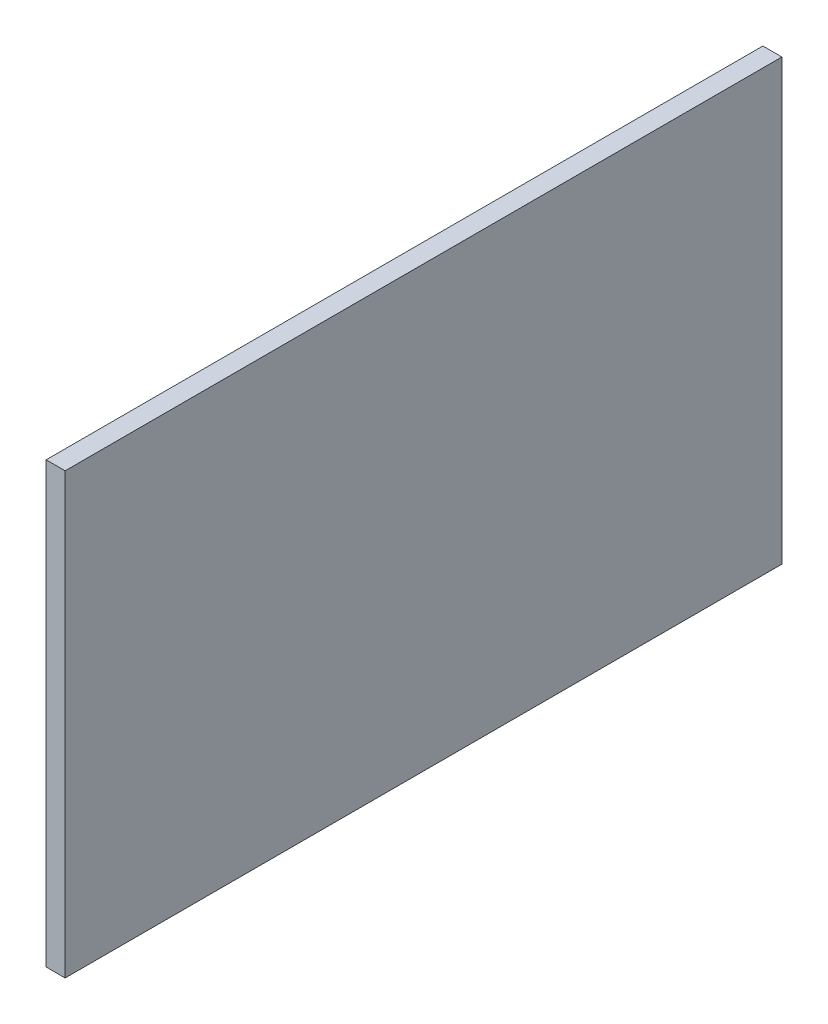
ISO-10303-21;
HEADER;
FILE_DESCRIPTION(('STEP AP214'),'2;1');
FILE_NAME('part.step','',(''),(''),'','','');
FILE_SCHEMA(('AUTOMOTIVE_DESIGN { 1 0 10303 214 1 1 1 1 }'));
ENDSEC;
DATA;
#1=APPLICATION_CONTEXT('core data for automotive mechanical design processes');
#2=APPLICATION_PROTOCOL_DEFINITION('international standard','automotive_design',2000,#1);
#3=PRODUCT_CONTEXT('',#1,'mechanical');
#4=PRODUCT('Part','Part','',(#3));
#5=PRODUCT_RELATED_PRODUCT_CATEGORY('part','',(#4));
#6=PRODUCT_DEFINITION_FORMATION('','',#4);
#7=PRODUCT_DEFINITION_CONTEXT('part definition',#1,'design');
#8=PRODUCT_DEFINITION('design','',#6,#7);
#9=PRODUCT_DEFINITION_SHAPE('','',#8);
#10=(LENGTH_UNIT() NAMED_UNIT(*) SI_UNIT(.MILLI.,.METRE.));
#11=(NAMED_UNIT(*) PLANE_ANGLE_UNIT() SI_UNIT($,.RADIAN.));
#12=(NAMED_UNIT(*) SI_UNIT($,.STERADIAN.) SOLID_ANGLE_UNIT());
#13=UNCERTAINTY_MEASURE_WITH_UNIT(LENGTH_MEASURE(1.E-05),#10,'distance_accuracy_value','');
#14=(GEOMETRIC_REPRESENTATION_CONTEXT(3) GLOBAL_UNCERTAINTY_ASSIGNED_CONTEXT((#13)) GLOBAL_UNIT_ASSIGNED_CONTEXT((#10,
#11,#12)) REPRESENTATION_CONTEXT('',''));
#15=CARTESIAN_POINT('',(0.,0.,0.));
#16=DIRECTION('',(0.,0.,1.));
#17=DIRECTION('',(1.,0.,0.));
#18=AXIS2_PLACEMENT_3D('',#15,#16,#17);
#19=CARTESIAN_POINT('',(12.,0.,0.));
#20=DIRECTION('',(0.,0.,-1.));
#21=DIRECTION('',(-1.,0.,0.));
#22=AXIS2_PLACEMENT_3D('',#19,#20,#21);
#23=PLANE('',#22);
#24=DIRECTION('',(0.,-1.,0.));
#25=VECTOR('',#24,1.);
#26=CARTESIAN_POINT('',(0.,0.,0.));
#27=LINE('',#26,#25);
#28=CARTESIAN_POINT('',(0.,277.,0.));
#29=VERTEX_POINT('',#28);
#30=CARTESIAN_POINT('',(0.,0.,0.));
#31=VERTEX_POINT('',#30);
#32=EDGE_CURVE('E95',#29,#31,#27,.T.);
#33=ORIENTED_EDGE('',*,*,#32,.T.);
#34=DIRECTION('',(-1.,0.,0.));
#35=VECTOR('',#34,1.);
#36=CARTESIAN_POINT('',(12.,0.,0.));
#37=LINE('',#36,#35);
#38=CARTESIAN_POINT('',(12.,0.,0.));
#39=VERTEX_POINT('',#38);
#40=EDGE_CURVE('E11',#39,#31,#37,.T.);
#41=ORIENTED_EDGE('',*,*,#40,.F.);
#42=DIRECTION('',(0.,-1.,0.));
#43=VECTOR('',#42,1.);
#44=CARTESIAN_POINT('',(12.,0.,0.));
#45=LINE('',#44,#43);
#46=CARTESIAN_POINT('',(12.,277.,0.));
#47=VERTEX_POINT('',#46);
#48=EDGE_CURVE('E83',#47,#39,#45,.T.);
#49=ORIENTED_EDGE('',*,*,#48,.F.);
#50=DIRECTION('',(-1.,0.,0.));
#51=VECTOR('',#50,1.);
#52=CARTESIAN_POINT('',(12.,277.,0.));
#53=LINE('',#52,#51);
#54=EDGE_CURVE('E91',#47,#29,#53,.T.);
#55=ORIENTED_EDGE('',*,*,#54,.T.);
#56=EDGE_LOOP('',(#33,#41,#49,#55));
#57=FACE_BOUND('',#56,.T.);
#58=ADVANCED_FACE('F32',(#57),#23,.F.);
#59=CARTESIAN_POINT('',(12.,0.,0.));
#60=DIRECTION('',(0.,1.,0.));
#61=DIRECTION('',(0.,0.,1.));
#62=AXIS2_PLACEMENT_3D('',#59,#60,#61);
#63=PLANE('',#62);
#64=DIRECTION('',(0.,0.,-1.));
#65=VECTOR('',#64,1.);
#66=CARTESIAN_POINT('',(0.,0.,0.));
#67=LINE('',#66,#65);
#68=CARTESIAN_POINT('',(0.,0.,-452.));
#69=VERTEX_POINT('',#68);
#70=EDGE_CURVE('E87',#31,#69,#67,.T.);
#71=ORIENTED_EDGE('',*,*,#70,.T.);
#72=DIRECTION('',(-1.,0.,0.));
#73=VECTOR('',#72,1.);
#74=CARTESIAN_POINT('',(12.,0.,-452.));
#75=LINE('',#74,#73);
#76=CARTESIAN_POINT('',(12.,0.,-452.));
#77=VERTEX_POINT('',#76);
#78=EDGE_CURVE('E40',#77,#69,#75,.T.);
#79=ORIENTED_EDGE('',*,*,#78,.F.);
#80=DIRECTION('',(0.,0.,-1.));
#81=VECTOR('',#80,1.);
#82=CARTESIAN_POINT('',(12.,0.,0.));
#83=LINE('',#82,#81);
#84=EDGE_CURVE('E78',#39,#77,#83,.T.);
#85=ORIENTED_EDGE('',*,*,#84,.F.);
#86=ORIENTED_EDGE('',*,*,#40,.T.);
#87=EDGE_LOOP('',(#71,#79,#85,#86));
#88=FACE_BOUND('',#87,.T.);
#89=ADVANCED_FACE('F86',(#88),#63,.F.);
#90=CARTESIAN_POINT('',(12.,0.,-452.));
#91=DIRECTION('',(0.,0.,1.));
#92=DIRECTION('',(1.,0.,0.));
#93=AXIS2_PLACEMENT_3D('',#90,#91,#92);
#94=PLANE('',#93);
#95=DIRECTION('',(0.,1.,0.));
#96=VECTOR('',#95,1.);
#97=CARTESIAN_POINT('',(0.,0.,-452.));
#98=LINE('',#97,#96);
#99=CARTESIAN_POINT('',(0.,277.,-452.));
#100=VERTEX_POINT('',#99);
#101=EDGE_CURVE('E65',#69,#100,#98,.T.);
#102=ORIENTED_EDGE('',*,*,#101,.T.);
#103=DIRECTION('',(-1.,0.,0.));
#104=VECTOR('',#103,1.);
#105=CARTESIAN_POINT('',(12.,277.,-452.));
#106=LINE('',#105,#104);
#107=CARTESIAN_POINT('',(12.,277.,-452.));
#108=VERTEX_POINT('',#107);
#109=EDGE_CURVE('E88',#108,#100,#106,.T.);
#110=ORIENTED_EDGE('',*,*,#109,.F.);
#111=DIRECTION('',(0.,1.,0.));
#112=VECTOR('',#111,1.);
#113=CARTESIAN_POINT('',(12.,0.,-452.));
#114=LINE('',#113,#112);
#115=EDGE_CURVE('E81',#77,#108,#114,.T.);
#116=ORIENTED_EDGE('',*,*,#115,.F.);
#117=ORIENTED_EDGE('',*,*,#78,.T.);
#118=EDGE_LOOP('',(#102,#110,#116,#117));
#119=FACE_BOUND('',#118,.T.);
#120=ADVANCED_FACE('F89',(#119),#94,.F.);
#121=CARTESIAN_POINT('',(12.,277.,0.));
#122=DIRECTION('',(0.,-1.,0.));
#123=DIRECTION('',(0.,0.,-1.));
#124=AXIS2_PLACEMENT_3D('',#121,#122,#123);
#125=PLANE('',#124);
#126=DIRECTION('',(0.,0.,1.));
#127=VECTOR('',#126,1.);
#128=CARTESIAN_POINT('',(0.,277.,0.));
#129=LINE('',#128,#127);
#130=EDGE_CURVE('E71',#100,#29,#129,.T.);
#131=ORIENTED_EDGE('',*,*,#130,.T.);
#132=ORIENTED_EDGE('',*,*,#54,.F.);
#133=DIRECTION('',(0.,0.,1.));
#134=VECTOR('',#133,1.);
#135=CARTESIAN_POINT('',(12.,277.,0.));
#136=LINE('',#135,#134);
#137=EDGE_CURVE('E48',#108,#47,#136,.T.);
#138=ORIENTED_EDGE('',*,*,#137,.F.);
#139=ORIENTED_EDGE('',*,*,#109,.T.);
#140=EDGE_LOOP('',(#131,#132,#138,#139));
#141=FACE_BOUND('',#140,.T.);
#142=ADVANCED_FACE('F102',(#141),#125,.F.);
#143=CARTESIAN_POINT('',(12.,0.,0.));
#144=DIRECTION('',(-1.,0.,0.));
#145=DIRECTION('',(0.,0.,1.));
#146=AXIS2_PLACEMENT_3D('',#143,#144,#145);
#147=PLANE('',#146);
#148=ORIENTED_EDGE('',*,*,#48,.T.);
#149=ORIENTED_EDGE('',*,*,#84,.T.);
#150=ORIENTED_EDGE('',*,*,#115,.T.);
#151=ORIENTED_EDGE('',*,*,#137,.T.);
#152=EDGE_LOOP('',(#148,#149,#150,#151));
#153=FACE_BOUND('',#152,.T.);
#154=ADVANCED_FACE('F79',(#153),#147,.F.);
#155=CARTESIAN_POINT('',(0.,0.,0.));
#156=DIRECTION('',(-1.,0.,0.));
#157=DIRECTION('',(0.,0.,1.));
#158=AXIS2_PLACEMENT_3D('',#155,#156,#157);
#159=PLANE('',#158);
#160=ORIENTED_EDGE('',*,*,#32,.F.);
#161=ORIENTED_EDGE('',*,*,#130,.F.);
#162=ORIENTED_EDGE('',*,*,#101,.F.);
#163=ORIENTED_EDGE('',*,*,#70,.F.);
#164=EDGE_LOOP('',(#160,#161,#162,#163));
#165=FACE_BOUND('',#164,.T.);
#166=ADVANCED_FACE('F105',(#165),#159,.T.);
#167=CLOSED_SHELL('',(#58,#89,#120,#142,#154,#166));
#168=MANIFOLD_SOLID_BREP('B2',#167);
#169=ADVANCED_BREP_SHAPE_REPRESENTATION('',(#18,#168),#14);
#170=SHAPE_DEFINITION_REPRESENTATION(#9,#169);
ENDSEC;
END-ISO-10303-21;
